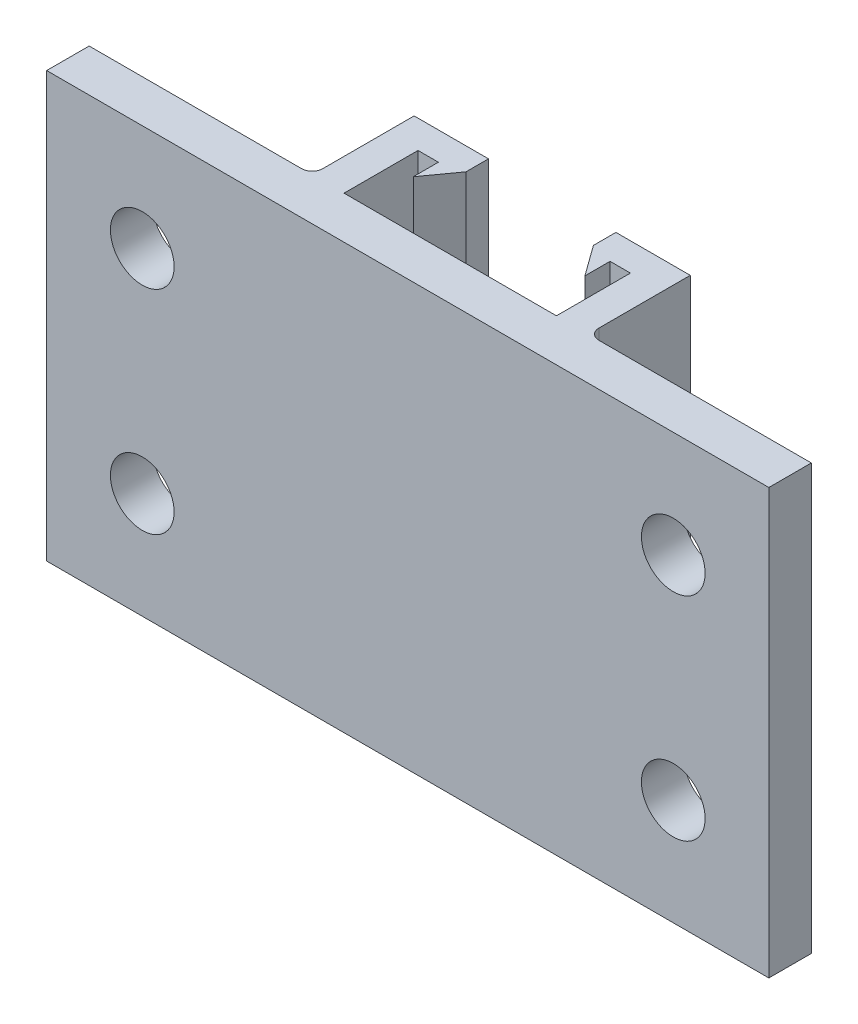
ISO-10303-21;
HEADER;
FILE_DESCRIPTION(('STEP AP214'),'2;1');
FILE_NAME('part.step','',(''),(''),'','','');
FILE_SCHEMA(('AUTOMOTIVE_DESIGN { 1 0 10303 214 1 1 1 1 }'));
ENDSEC;
DATA;
#1=APPLICATION_CONTEXT('core data for automotive mechanical design processes');
#2=APPLICATION_PROTOCOL_DEFINITION('international standard','automotive_design',2000,#1);
#3=PRODUCT_CONTEXT('',#1,'mechanical');
#4=PRODUCT('Part','Part','',(#3));
#5=PRODUCT_RELATED_PRODUCT_CATEGORY('part','',(#4));
#6=PRODUCT_DEFINITION_FORMATION('','',#4);
#7=PRODUCT_DEFINITION_CONTEXT('part definition',#1,'design');
#8=PRODUCT_DEFINITION('design','',#6,#7);
#9=PRODUCT_DEFINITION_SHAPE('','',#8);
#10=(LENGTH_UNIT() NAMED_UNIT(*) SI_UNIT(.MILLI.,.METRE.));
#11=(NAMED_UNIT(*) PLANE_ANGLE_UNIT() SI_UNIT($,.RADIAN.));
#12=(NAMED_UNIT(*) SI_UNIT($,.STERADIAN.) SOLID_ANGLE_UNIT());
#13=UNCERTAINTY_MEASURE_WITH_UNIT(LENGTH_MEASURE(1.E-05),#10,'distance_accuracy_value','');
#14=(GEOMETRIC_REPRESENTATION_CONTEXT(3) GLOBAL_UNCERTAINTY_ASSIGNED_CONTEXT((#13)) GLOBAL_UNIT_ASSIGNED_CONTEXT((#10,
#11,#12)) REPRESENTATION_CONTEXT('',''));
#15=CARTESIAN_POINT('',(0.,0.,0.));
#16=DIRECTION('',(0.,0.,1.));
#17=DIRECTION('',(1.,0.,0.));
#18=AXIS2_PLACEMENT_3D('',#15,#16,#17);
#19=CARTESIAN_POINT('',(0.,0.,0.));
#20=DIRECTION('',(0.,0.,1.));
#21=DIRECTION('',(1.,0.,0.));
#22=AXIS2_PLACEMENT_3D('',#19,#20,#21);
#23=PLANE('',#22);
#24=CARTESIAN_POINT('',(12.5,5.,0.));
#25=DIRECTION('',(0.,0.,1.));
#26=DIRECTION('',(1.,0.,0.));
#27=AXIS2_PLACEMENT_3D('',#24,#25,#26);
#28=CIRCLE('',#27,1.5);
#29=CARTESIAN_POINT('',(14.,5.,0.));
#30=VERTEX_POINT('',#29);
#31=EDGE_CURVE('E396',#30,#30,#28,.T.);
#32=ORIENTED_EDGE('',*,*,#31,.T.);
#33=EDGE_LOOP('',(#32));
#34=FACE_BOUND('',#33,.T.);
#35=CARTESIAN_POINT('',(12.5000000000001,-5.,0.));
#36=DIRECTION('',(0.,0.,1.));
#37=DIRECTION('',(1.,0.,0.));
#38=AXIS2_PLACEMENT_3D('',#35,#36,#37);
#39=CIRCLE('',#38,1.5);
#40=CARTESIAN_POINT('',(14.0000000000001,-5.,0.));
#41=VERTEX_POINT('',#40);
#42=EDGE_CURVE('E338',#41,#41,#39,.T.);
#43=ORIENTED_EDGE('',*,*,#42,.T.);
#44=EDGE_LOOP('',(#43));
#45=FACE_BOUND('',#44,.T.);
#46=DIRECTION('',(1.,0.,0.));
#47=VECTOR('',#46,1.);
#48=CARTESIAN_POINT('',(0.,-10.,0.));
#49=LINE('',#48,#47);
#50=CARTESIAN_POINT('',(7.,-10.,0.));
#51=VERTEX_POINT('',#50);
#52=CARTESIAN_POINT('',(17.,-10.,0.));
#53=VERTEX_POINT('',#52);
#54=EDGE_CURVE('E404',#51,#53,#49,.T.);
#55=ORIENTED_EDGE('',*,*,#54,.F.);
#56=DIRECTION('',(0.,1.,0.));
#57=VECTOR('',#56,1.);
#58=CARTESIAN_POINT('',(7.,0.,0.));
#59=LINE('',#58,#57);
#60=CARTESIAN_POINT('',(7.,10.,0.));
#61=VERTEX_POINT('',#60);
#62=EDGE_CURVE('E434',#51,#61,#59,.T.);
#63=ORIENTED_EDGE('',*,*,#62,.T.);
#64=DIRECTION('',(1.,0.,0.));
#65=VECTOR('',#64,1.);
#66=CARTESIAN_POINT('',(0.,10.,0.));
#67=LINE('',#66,#65);
#68=CARTESIAN_POINT('',(17.,10.,0.));
#69=VERTEX_POINT('',#68);
#70=EDGE_CURVE('E413',#61,#69,#67,.T.);
#71=ORIENTED_EDGE('',*,*,#70,.T.);
#72=DIRECTION('',(0.,1.,0.));
#73=VECTOR('',#72,1.);
#74=CARTESIAN_POINT('',(17.,0.,0.));
#75=LINE('',#74,#73);
#76=EDGE_CURVE('E408',#53,#69,#75,.T.);
#77=ORIENTED_EDGE('',*,*,#76,.F.);
#78=EDGE_LOOP('',(#55,#63,#71,#77));
#79=FACE_BOUND('',#78,.T.);
#80=ADVANCED_FACE('F40',(#34,#45,#79),#23,.F.);
#81=CARTESIAN_POINT('',(-12.4999999999999,-5.00000000000018,0.));
#82=DIRECTION('',(0.,0.,1.));
#83=DIRECTION('',(1.,0.,0.));
#84=AXIS2_PLACEMENT_3D('',#81,#82,#83);
#85=CIRCLE('',#84,1.5);
#86=CARTESIAN_POINT('',(-10.9999999999999,-5.00000000000018,0.));
#87=VERTEX_POINT('',#86);
#88=EDGE_CURVE('E392',#87,#87,#85,.T.);
#89=ORIENTED_EDGE('',*,*,#88,.T.);
#90=EDGE_LOOP('',(#89));
#91=FACE_BOUND('',#90,.T.);
#92=CARTESIAN_POINT('',(-12.5,4.99999999999982,0.));
#93=DIRECTION('',(0.,0.,1.));
#94=DIRECTION('',(1.,0.,0.));
#95=AXIS2_PLACEMENT_3D('',#92,#93,#94);
#96=CIRCLE('',#95,1.5);
#97=CARTESIAN_POINT('',(-11.,4.99999999999982,0.));
#98=VERTEX_POINT('',#97);
#99=EDGE_CURVE('E400',#98,#98,#96,.T.);
#100=ORIENTED_EDGE('',*,*,#99,.T.);
#101=EDGE_LOOP('',(#100));
#102=FACE_BOUND('',#101,.T.);
#103=CARTESIAN_POINT('',(-17.,10.,0.));
#104=VERTEX_POINT('',#103);
#105=CARTESIAN_POINT('',(-7.,10.,0.));
#106=VERTEX_POINT('',#105);
#107=EDGE_CURVE('E414',#104,#106,#67,.T.);
#108=ORIENTED_EDGE('',*,*,#107,.T.);
#109=DIRECTION('',(0.,1.,0.));
#110=VECTOR('',#109,1.);
#111=CARTESIAN_POINT('',(-7.,0.,0.));
#112=LINE('',#111,#110);
#113=CARTESIAN_POINT('',(-7.,-10.,0.));
#114=VERTEX_POINT('',#113);
#115=EDGE_CURVE('E62',#106,#114,#112,.F.);
#116=ORIENTED_EDGE('',*,*,#115,.T.);
#117=CARTESIAN_POINT('',(-17.,-10.,0.));
#118=VERTEX_POINT('',#117);
#119=EDGE_CURVE('E405',#118,#114,#49,.T.);
#120=ORIENTED_EDGE('',*,*,#119,.F.);
#121=DIRECTION('',(0.,1.,0.));
#122=VECTOR('',#121,1.);
#123=CARTESIAN_POINT('',(-17.,0.,0.));
#124=LINE('',#123,#122);
#125=EDGE_CURVE('E361',#118,#104,#124,.T.);
#126=ORIENTED_EDGE('',*,*,#125,.T.);
#127=EDGE_LOOP('',(#108,#116,#120,#126));
#128=FACE_BOUND('',#127,.T.);
#129=ADVANCED_FACE('F477',(#91,#102,#128),#23,.F.);
#130=CARTESIAN_POINT('',(0.,-10.,2.));
#131=DIRECTION('',(0.,1.,0.));
#132=DIRECTION('',(0.,0.,1.));
#133=AXIS2_PLACEMENT_3D('',#130,#131,#132);
#134=PLANE('',#133);
#135=ORIENTED_EDGE('',*,*,#119,.T.);
#136=CARTESIAN_POINT('',(-7.,-10.,-0.5));
#137=DIRECTION('',(0.,1.,0.));
#138=DIRECTION('',(0.,0.,1.));
#139=AXIS2_PLACEMENT_3D('',#136,#137,#138);
#140=CIRCLE('',#139,0.5);
#141=CARTESIAN_POINT('',(-6.5,-10.,-0.5));
#142=VERTEX_POINT('',#141);
#143=EDGE_CURVE('E11',#114,#142,#140,.T.);
#144=ORIENTED_EDGE('',*,*,#143,.T.);
#145=DIRECTION('',(0.,0.,1.));
#146=VECTOR('',#145,1.);
#147=CARTESIAN_POINT('',(-6.5,-10.,0.));
#148=LINE('',#147,#146);
#149=CARTESIAN_POINT('',(-6.5,-10.,-4.8));
#150=VERTEX_POINT('',#149);
#151=EDGE_CURVE('E304',#150,#142,#148,.T.);
#152=ORIENTED_EDGE('',*,*,#151,.F.);
#153=DIRECTION('',(-1.,0.,0.));
#154=VECTOR('',#153,1.);
#155=CARTESIAN_POINT('',(-3.,-10.,-4.8));
#156=LINE('',#155,#154);
#157=CARTESIAN_POINT('',(-3.,-10.,-4.8));
#158=VERTEX_POINT('',#157);
#159=EDGE_CURVE('E300',#158,#150,#156,.T.);
#160=ORIENTED_EDGE('',*,*,#159,.F.);
#161=DIRECTION('',(0.,0.,-1.));
#162=VECTOR('',#161,1.);
#163=CARTESIAN_POINT('',(-3.,-10.,-4.8));
#164=LINE('',#163,#162);
#165=CARTESIAN_POINT('',(-3.,-10.,-3.74108937767735));
#166=VERTEX_POINT('',#165);
#167=EDGE_CURVE('E296',#166,#158,#164,.T.);
#168=ORIENTED_EDGE('',*,*,#167,.F.);
#169=DIRECTION('',(0.58540795940283,0.,-0.810738873539325));
#170=VECTOR('',#169,1.);
#171=CARTESIAN_POINT('',(-3.,-10.,-3.74108937767735));
#172=LINE('',#171,#170);
#173=CARTESIAN_POINT('',(-4.04056339153975,-10.,-2.3));
#174=VERTEX_POINT('',#173);
#175=EDGE_CURVE('E292',#174,#166,#172,.T.);
#176=ORIENTED_EDGE('',*,*,#175,.F.);
#177=DIRECTION('',(0.,0.,1.));
#178=VECTOR('',#177,1.);
#179=CARTESIAN_POINT('',(-4.04056339153975,-10.,-2.3));
#180=LINE('',#179,#178);
#181=CARTESIAN_POINT('',(-4.04056339153975,-10.,-3.48273201808669));
#182=VERTEX_POINT('',#181);
#183=EDGE_CURVE('E288',#182,#174,#180,.T.);
#184=ORIENTED_EDGE('',*,*,#183,.F.);
#185=DIRECTION('',(1.,0.,0.));
#186=VECTOR('',#185,1.);
#187=CARTESIAN_POINT('',(-4.04056339153975,-10.,-3.48273201808669));
#188=LINE('',#187,#186);
#189=CARTESIAN_POINT('',(-5.,-10.,-3.48273201808669));
#190=VERTEX_POINT('',#189);
#191=EDGE_CURVE('E283',#190,#182,#188,.T.);
#192=ORIENTED_EDGE('',*,*,#191,.F.);
#193=DIRECTION('',(0.,0.,-1.));
#194=VECTOR('',#193,1.);
#195=CARTESIAN_POINT('',(-5.,-10.,0.));
#196=LINE('',#195,#194);
#197=CARTESIAN_POINT('',(-5.,-10.,0.));
#198=VERTEX_POINT('',#197);
#199=EDGE_CURVE('E279',#198,#190,#196,.T.);
#200=ORIENTED_EDGE('',*,*,#199,.F.);
#201=CARTESIAN_POINT('',(5.,-10.,0.));
#202=VERTEX_POINT('',#201);
#203=EDGE_CURVE('E409',#198,#202,#49,.T.);
#204=ORIENTED_EDGE('',*,*,#203,.T.);
#205=DIRECTION('',(0.,0.,1.));
#206=VECTOR('',#205,1.);
#207=CARTESIAN_POINT('',(5.,-10.,0.));
#208=LINE('',#207,#206);
#209=CARTESIAN_POINT('',(5.,-10.,-3.48273201808669));
#210=VERTEX_POINT('',#209);
#211=EDGE_CURVE('E232',#210,#202,#208,.T.);
#212=ORIENTED_EDGE('',*,*,#211,.F.);
#213=DIRECTION('',(1.,0.,0.));
#214=VECTOR('',#213,1.);
#215=CARTESIAN_POINT('',(4.04056339153975,-10.,-3.48273201808669));
#216=LINE('',#215,#214);
#217=CARTESIAN_POINT('',(4.04056339153975,-10.,-3.48273201808669));
#218=VERTEX_POINT('',#217);
#219=EDGE_CURVE('E228',#218,#210,#216,.T.);
#220=ORIENTED_EDGE('',*,*,#219,.F.);
#221=DIRECTION('',(0.,0.,-1.));
#222=VECTOR('',#221,1.);
#223=CARTESIAN_POINT('',(4.04056339153975,-10.,-2.3));
#224=LINE('',#223,#222);
#225=CARTESIAN_POINT('',(4.04056339153975,-10.,-2.3));
#226=VERTEX_POINT('',#225);
#227=EDGE_CURVE('E213',#226,#218,#224,.T.);
#228=ORIENTED_EDGE('',*,*,#227,.F.);
#229=DIRECTION('',(0.58540795940283,0.,0.810738873539325));
#230=VECTOR('',#229,1.);
#231=CARTESIAN_POINT('',(3.,-10.,-3.74108937767735));
#232=LINE('',#231,#230);
#233=CARTESIAN_POINT('',(3.,-10.,-3.74108937767735));
#234=VERTEX_POINT('',#233);
#235=EDGE_CURVE('E193',#234,#226,#232,.T.);
#236=ORIENTED_EDGE('',*,*,#235,.F.);
#237=DIRECTION('',(0.,0.,1.));
#238=VECTOR('',#237,1.);
#239=CARTESIAN_POINT('',(3.,-10.,-4.8));
#240=LINE('',#239,#238);
#241=CARTESIAN_POINT('',(3.,-10.,-4.8));
#242=VERTEX_POINT('',#241);
#243=EDGE_CURVE('E209',#242,#234,#240,.T.);
#244=ORIENTED_EDGE('',*,*,#243,.F.);
#245=DIRECTION('',(-1.,0.,0.));
#246=VECTOR('',#245,1.);
#247=CARTESIAN_POINT('',(3.,-10.,-4.8));
#248=LINE('',#247,#246);
#249=CARTESIAN_POINT('',(6.5,-10.,-4.8));
#250=VERTEX_POINT('',#249);
#251=EDGE_CURVE('E202',#250,#242,#248,.T.);
#252=ORIENTED_EDGE('',*,*,#251,.F.);
#253=DIRECTION('',(0.,0.,-1.));
#254=VECTOR('',#253,1.);
#255=CARTESIAN_POINT('',(6.5,-10.,0.));
#256=LINE('',#255,#254);
#257=CARTESIAN_POINT('',(6.5,-10.,-0.5));
#258=VERTEX_POINT('',#257);
#259=EDGE_CURVE('E236',#258,#250,#256,.T.);
#260=ORIENTED_EDGE('',*,*,#259,.F.);
#261=CARTESIAN_POINT('',(7.,-10.,-0.5));
#262=DIRECTION('',(0.,1.,0.));
#263=DIRECTION('',(0.,0.,1.));
#264=AXIS2_PLACEMENT_3D('',#261,#262,#263);
#265=CIRCLE('',#264,0.5);
#266=EDGE_CURVE('E450',#258,#51,#265,.T.);
#267=ORIENTED_EDGE('',*,*,#266,.T.);
#268=ORIENTED_EDGE('',*,*,#54,.T.);
#269=DIRECTION('',(0.,0.,-1.));
#270=VECTOR('',#269,1.);
#271=CARTESIAN_POINT('',(17.,-10.,2.));
#272=LINE('',#271,#270);
#273=CARTESIAN_POINT('',(17.,-10.,2.));
#274=VERTEX_POINT('',#273);
#275=EDGE_CURVE('E430',#274,#53,#272,.T.);
#276=ORIENTED_EDGE('',*,*,#275,.F.);
#277=DIRECTION('',(1.,0.,0.));
#278=VECTOR('',#277,1.);
#279=CARTESIAN_POINT('',(0.,-10.,2.));
#280=LINE('',#279,#278);
#281=CARTESIAN_POINT('',(-17.,-10.,2.));
#282=VERTEX_POINT('',#281);
#283=EDGE_CURVE('E373',#282,#274,#280,.T.);
#284=ORIENTED_EDGE('',*,*,#283,.F.);
#285=DIRECTION('',(0.,0.,-1.));
#286=VECTOR('',#285,1.);
#287=CARTESIAN_POINT('',(-17.,-10.,2.));
#288=LINE('',#287,#286);
#289=EDGE_CURVE('E388',#282,#118,#288,.T.);
#290=ORIENTED_EDGE('',*,*,#289,.T.);
#291=EDGE_LOOP('',(#135,#144,#152,#160,#168,#176,#184,#192,#200,#204,#212,#220,#228,#236,#244,
#252,#260,#267,#268,#276,#284,#290));
#292=FACE_BOUND('',#291,.T.);
#293=ADVANCED_FACE('F207',(#292),#134,.F.);
#294=CARTESIAN_POINT('',(17.,0.,2.));
#295=DIRECTION('',(-1.,0.,0.));
#296=DIRECTION('',(0.,0.,1.));
#297=AXIS2_PLACEMENT_3D('',#294,#295,#296);
#298=PLANE('',#297);
#299=ORIENTED_EDGE('',*,*,#76,.T.);
#300=DIRECTION('',(0.,0.,-1.));
#301=VECTOR('',#300,1.);
#302=CARTESIAN_POINT('',(17.,10.,2.));
#303=LINE('',#302,#301);
#304=CARTESIAN_POINT('',(17.,10.,2.));
#305=VERTEX_POINT('',#304);
#306=EDGE_CURVE('E426',#305,#69,#303,.T.);
#307=ORIENTED_EDGE('',*,*,#306,.F.);
#308=DIRECTION('',(0.,1.,0.));
#309=VECTOR('',#308,1.);
#310=CARTESIAN_POINT('',(17.,0.,2.));
#311=LINE('',#310,#309);
#312=EDGE_CURVE('E377',#274,#305,#311,.T.);
#313=ORIENTED_EDGE('',*,*,#312,.F.);
#314=ORIENTED_EDGE('',*,*,#275,.T.);
#315=EDGE_LOOP('',(#299,#307,#313,#314));
#316=FACE_BOUND('',#315,.T.);
#317=ADVANCED_FACE('F469',(#316),#298,.F.);
#318=CARTESIAN_POINT('',(0.,10.,2.));
#319=DIRECTION('',(0.,1.,0.));
#320=DIRECTION('',(0.,0.,1.));
#321=AXIS2_PLACEMENT_3D('',#318,#319,#320);
#322=PLANE('',#321);
#323=ORIENTED_EDGE('',*,*,#107,.F.);
#324=DIRECTION('',(0.,0.,-1.));
#325=VECTOR('',#324,1.);
#326=CARTESIAN_POINT('',(-17.,10.,2.));
#327=LINE('',#326,#325);
#328=CARTESIAN_POINT('',(-17.,10.,2.));
#329=VERTEX_POINT('',#328);
#330=EDGE_CURVE('E423',#329,#104,#327,.T.);
#331=ORIENTED_EDGE('',*,*,#330,.F.);
#332=DIRECTION('',(1.,0.,0.));
#333=VECTOR('',#332,1.);
#334=CARTESIAN_POINT('',(0.,10.,2.));
#335=LINE('',#334,#333);
#336=EDGE_CURVE('E380',#329,#305,#335,.T.);
#337=ORIENTED_EDGE('',*,*,#336,.T.);
#338=ORIENTED_EDGE('',*,*,#306,.T.);
#339=ORIENTED_EDGE('',*,*,#70,.F.);
#340=CARTESIAN_POINT('',(7.,10.,-0.5));
#341=DIRECTION('',(0.,1.,0.));
#342=DIRECTION('',(0.,0.,1.));
#343=AXIS2_PLACEMENT_3D('',#340,#341,#342);
#344=CIRCLE('',#343,0.5);
#345=CARTESIAN_POINT('',(6.5,10.,-0.5));
#346=VERTEX_POINT('',#345);
#347=EDGE_CURVE('E447',#61,#346,#344,.F.);
#348=ORIENTED_EDGE('',*,*,#347,.T.);
#349=DIRECTION('',(0.,0.,-1.));
#350=VECTOR('',#349,1.);
#351=CARTESIAN_POINT('',(6.5,10.,0.));
#352=LINE('',#351,#350);
#353=CARTESIAN_POINT('',(6.5,10.,-4.8));
#354=VERTEX_POINT('',#353);
#355=EDGE_CURVE('E223',#346,#354,#352,.T.);
#356=ORIENTED_EDGE('',*,*,#355,.T.);
#357=DIRECTION('',(-1.,0.,0.));
#358=VECTOR('',#357,1.);
#359=CARTESIAN_POINT('',(3.,10.,-4.8));
#360=LINE('',#359,#358);
#361=CARTESIAN_POINT('',(3.,10.,-4.8));
#362=VERTEX_POINT('',#361);
#363=EDGE_CURVE('E219',#354,#362,#360,.T.);
#364=ORIENTED_EDGE('',*,*,#363,.T.);
#365=DIRECTION('',(0.,0.,1.));
#366=VECTOR('',#365,1.);
#367=CARTESIAN_POINT('',(3.,10.,-4.8));
#368=LINE('',#367,#366);
#369=CARTESIAN_POINT('',(3.,10.,-3.74108937767735));
#370=VERTEX_POINT('',#369);
#371=EDGE_CURVE('E241',#362,#370,#368,.T.);
#372=ORIENTED_EDGE('',*,*,#371,.T.);
#373=DIRECTION('',(0.58540795940283,0.,0.810738873539325));
#374=VECTOR('',#373,1.);
#375=CARTESIAN_POINT('',(3.,10.,-3.74108937767735));
#376=LINE('',#375,#374);
#377=CARTESIAN_POINT('',(4.04056339153975,10.,-2.3));
#378=VERTEX_POINT('',#377);
#379=EDGE_CURVE('E195',#370,#378,#376,.T.);
#380=ORIENTED_EDGE('',*,*,#379,.T.);
#381=DIRECTION('',(0.,0.,-1.));
#382=VECTOR('',#381,1.);
#383=CARTESIAN_POINT('',(4.04056339153975,10.,-2.3));
#384=LINE('',#383,#382);
#385=CARTESIAN_POINT('',(4.04056339153975,10.,-3.48273201808669));
#386=VERTEX_POINT('',#385);
#387=EDGE_CURVE('E246',#378,#386,#384,.T.);
#388=ORIENTED_EDGE('',*,*,#387,.T.);
#389=DIRECTION('',(1.,0.,0.));
#390=VECTOR('',#389,1.);
#391=CARTESIAN_POINT('',(4.04056339153975,10.,-3.48273201808669));
#392=LINE('',#391,#390);
#393=CARTESIAN_POINT('',(5.,10.,-3.48273201808669));
#394=VERTEX_POINT('',#393);
#395=EDGE_CURVE('E250',#386,#394,#392,.T.);
#396=ORIENTED_EDGE('',*,*,#395,.T.);
#397=DIRECTION('',(0.,0.,1.));
#398=VECTOR('',#397,1.);
#399=CARTESIAN_POINT('',(5.,10.,0.));
#400=LINE('',#399,#398);
#401=CARTESIAN_POINT('',(5.,10.,0.));
#402=VERTEX_POINT('',#401);
#403=EDGE_CURVE('E254',#394,#402,#400,.T.);
#404=ORIENTED_EDGE('',*,*,#403,.T.);
#405=CARTESIAN_POINT('',(-5.,10.,0.));
#406=VERTEX_POINT('',#405);
#407=EDGE_CURVE('E417',#406,#402,#67,.T.);
#408=ORIENTED_EDGE('',*,*,#407,.F.);
#409=DIRECTION('',(0.,0.,-1.));
#410=VECTOR('',#409,1.);
#411=CARTESIAN_POINT('',(-5.,10.,0.));
#412=LINE('',#411,#410);
#413=CARTESIAN_POINT('',(-5.,10.,-3.48273201808669));
#414=VERTEX_POINT('',#413);
#415=EDGE_CURVE('E262',#406,#414,#412,.T.);
#416=ORIENTED_EDGE('',*,*,#415,.T.);
#417=DIRECTION('',(1.,0.,0.));
#418=VECTOR('',#417,1.);
#419=CARTESIAN_POINT('',(-4.04056339153975,10.,-3.48273201808669));
#420=LINE('',#419,#418);
#421=CARTESIAN_POINT('',(-4.04056339153975,10.,-3.48273201808669));
#422=VERTEX_POINT('',#421);
#423=EDGE_CURVE('E312',#414,#422,#420,.T.);
#424=ORIENTED_EDGE('',*,*,#423,.T.);
#425=DIRECTION('',(0.,0.,1.));
#426=VECTOR('',#425,1.);
#427=CARTESIAN_POINT('',(-4.04056339153975,10.,-2.3));
#428=LINE('',#427,#426);
#429=CARTESIAN_POINT('',(-4.04056339153975,10.,-2.3));
#430=VERTEX_POINT('',#429);
#431=EDGE_CURVE('E316',#422,#430,#428,.T.);
#432=ORIENTED_EDGE('',*,*,#431,.T.);
#433=DIRECTION('',(0.58540795940283,0.,-0.810738873539325));
#434=VECTOR('',#433,1.);
#435=CARTESIAN_POINT('',(-3.,10.,-3.74108937767735));
#436=LINE('',#435,#434);
#437=CARTESIAN_POINT('',(-3.,10.,-3.74108937767735));
#438=VERTEX_POINT('',#437);
#439=EDGE_CURVE('E320',#430,#438,#436,.T.);
#440=ORIENTED_EDGE('',*,*,#439,.T.);
#441=DIRECTION('',(0.,0.,-1.));
#442=VECTOR('',#441,1.);
#443=CARTESIAN_POINT('',(-3.,10.,-4.8));
#444=LINE('',#443,#442);
#445=CARTESIAN_POINT('',(-3.,10.,-4.8));
#446=VERTEX_POINT('',#445);
#447=EDGE_CURVE('E324',#438,#446,#444,.T.);
#448=ORIENTED_EDGE('',*,*,#447,.T.);
#449=DIRECTION('',(-1.,0.,0.));
#450=VECTOR('',#449,1.);
#451=CARTESIAN_POINT('',(-3.,10.,-4.8));
#452=LINE('',#451,#450);
#453=CARTESIAN_POINT('',(-6.5,10.,-4.8));
#454=VERTEX_POINT('',#453);
#455=EDGE_CURVE('E328',#446,#454,#452,.T.);
#456=ORIENTED_EDGE('',*,*,#455,.T.);
#457=DIRECTION('',(0.,0.,1.));
#458=VECTOR('',#457,1.);
#459=CARTESIAN_POINT('',(-6.5,10.,0.));
#460=LINE('',#459,#458);
#461=CARTESIAN_POINT('',(-6.5,10.,-0.5));
#462=VERTEX_POINT('',#461);
#463=EDGE_CURVE('E284',#454,#462,#460,.T.);
#464=ORIENTED_EDGE('',*,*,#463,.T.);
#465=CARTESIAN_POINT('',(-7.,10.,-0.5));
#466=DIRECTION('',(0.,1.,0.));
#467=DIRECTION('',(0.,0.,1.));
#468=AXIS2_PLACEMENT_3D('',#465,#466,#467);
#469=CIRCLE('',#468,0.5);
#470=EDGE_CURVE('E49',#462,#106,#469,.F.);
#471=ORIENTED_EDGE('',*,*,#470,.T.);
#472=EDGE_LOOP('',(#323,#331,#337,#338,#339,#348,#356,#364,#372,#380,#388,#396,#404,#408,#416,
#424,#432,#440,#448,#456,#464,#471));
#473=FACE_BOUND('',#472,.T.);
#474=ADVANCED_FACE('F479',(#473),#322,.T.);
#475=CARTESIAN_POINT('',(-12.5,4.99999999999982,2.));
#476=DIRECTION('',(0.,0.,-1.));
#477=DIRECTION('',(-1.,0.,0.));
#478=AXIS2_PLACEMENT_3D('',#475,#476,#477);
#479=CYLINDRICAL_SURFACE('',#478,1.5);
#480=CARTESIAN_POINT('',(-12.5,4.99999999999982,2.));
#481=DIRECTION('',(0.,0.,1.));
#482=DIRECTION('',(1.,0.,0.));
#483=AXIS2_PLACEMENT_3D('',#480,#481,#482);
#484=CIRCLE('',#483,1.5);
#485=CARTESIAN_POINT('',(-11.,4.99999999999982,2.));
#486=VERTEX_POINT('',#485);
#487=EDGE_CURVE('E369',#486,#486,#484,.T.);
#488=ORIENTED_EDGE('',*,*,#487,.T.);
#489=EDGE_LOOP('',(#488));
#490=FACE_BOUND('',#489,.T.);
#491=ORIENTED_EDGE('',*,*,#99,.F.);
#492=EDGE_LOOP('',(#491));
#493=FACE_BOUND('',#492,.T.);
#494=ADVANCED_FACE('F677',(#490,#493),#479,.F.);
#495=CARTESIAN_POINT('',(12.5,5.,2.));
#496=DIRECTION('',(0.,0.,-1.));
#497=DIRECTION('',(-1.,0.,0.));
#498=AXIS2_PLACEMENT_3D('',#495,#496,#497);
#499=CYLINDRICAL_SURFACE('',#498,1.5);
#500=CARTESIAN_POINT('',(12.5,5.,2.));
#501=DIRECTION('',(0.,0.,1.));
#502=DIRECTION('',(1.,0.,0.));
#503=AXIS2_PLACEMENT_3D('',#500,#501,#502);
#504=CIRCLE('',#503,1.5);
#505=CARTESIAN_POINT('',(14.,5.,2.));
#506=VERTEX_POINT('',#505);
#507=EDGE_CURVE('E365',#506,#506,#504,.T.);
#508=ORIENTED_EDGE('',*,*,#507,.T.);
#509=EDGE_LOOP('',(#508));
#510=FACE_BOUND('',#509,.T.);
#511=ORIENTED_EDGE('',*,*,#31,.F.);
#512=EDGE_LOOP('',(#511));
#513=FACE_BOUND('',#512,.T.);
#514=ADVANCED_FACE('F727',(#510,#513),#499,.F.);
#515=CARTESIAN_POINT('',(-12.4999999999999,-5.00000000000018,2.));
#516=DIRECTION('',(0.,0.,-1.));
#517=DIRECTION('',(-1.,0.,0.));
#518=AXIS2_PLACEMENT_3D('',#515,#516,#517);
#519=CYLINDRICAL_SURFACE('',#518,1.5);
#520=CARTESIAN_POINT('',(-12.4999999999999,-5.00000000000018,2.));
#521=DIRECTION('',(0.,0.,1.));
#522=DIRECTION('',(1.,0.,0.));
#523=AXIS2_PLACEMENT_3D('',#520,#521,#522);
#524=CIRCLE('',#523,1.5);
#525=CARTESIAN_POINT('',(-10.9999999999999,-5.00000000000018,2.));
#526=VERTEX_POINT('',#525);
#527=EDGE_CURVE('E360',#526,#526,#524,.T.);
#528=ORIENTED_EDGE('',*,*,#527,.T.);
#529=EDGE_LOOP('',(#528));
#530=FACE_BOUND('',#529,.T.);
#531=ORIENTED_EDGE('',*,*,#88,.F.);
#532=EDGE_LOOP('',(#531));
#533=FACE_BOUND('',#532,.T.);
#534=ADVANCED_FACE('F736',(#530,#533),#519,.F.);
#535=CARTESIAN_POINT('',(12.5000000000001,-5.,2.));
#536=DIRECTION('',(0.,0.,-1.));
#537=DIRECTION('',(-1.,0.,0.));
#538=AXIS2_PLACEMENT_3D('',#535,#536,#537);
#539=CYLINDRICAL_SURFACE('',#538,1.5);
#540=CARTESIAN_POINT('',(12.5000000000001,-5.,2.));
#541=DIRECTION('',(0.,0.,1.));
#542=DIRECTION('',(1.,0.,0.));
#543=AXIS2_PLACEMENT_3D('',#540,#541,#542);
#544=CIRCLE('',#543,1.5);
#545=CARTESIAN_POINT('',(14.0000000000001,-5.,2.));
#546=VERTEX_POINT('',#545);
#547=EDGE_CURVE('E356',#546,#546,#544,.T.);
#548=ORIENTED_EDGE('',*,*,#547,.T.);
#549=EDGE_LOOP('',(#548));
#550=FACE_BOUND('',#549,.T.);
#551=ORIENTED_EDGE('',*,*,#42,.F.);
#552=EDGE_LOOP('',(#551));
#553=FACE_BOUND('',#552,.T.);
#554=ADVANCED_FACE('F561',(#550,#553),#539,.F.);
#555=CARTESIAN_POINT('',(-17.,0.,2.));
#556=DIRECTION('',(-1.,0.,0.));
#557=DIRECTION('',(0.,0.,1.));
#558=AXIS2_PLACEMENT_3D('',#555,#556,#557);
#559=PLANE('',#558);
#560=ORIENTED_EDGE('',*,*,#125,.F.);
#561=ORIENTED_EDGE('',*,*,#289,.F.);
#562=DIRECTION('',(0.,1.,0.));
#563=VECTOR('',#562,1.);
#564=CARTESIAN_POINT('',(-17.,0.,2.));
#565=LINE('',#564,#563);
#566=EDGE_CURVE('E384',#282,#329,#565,.T.);
#567=ORIENTED_EDGE('',*,*,#566,.T.);
#568=ORIENTED_EDGE('',*,*,#330,.T.);
#569=EDGE_LOOP('',(#560,#561,#567,#568));
#570=FACE_BOUND('',#569,.T.);
#571=ADVANCED_FACE('F478',(#570),#559,.T.);
#572=CARTESIAN_POINT('',(0.,0.,2.));
#573=DIRECTION('',(0.,0.,1.));
#574=DIRECTION('',(1.,0.,0.));
#575=AXIS2_PLACEMENT_3D('',#572,#573,#574);
#576=PLANE('',#575);
#577=ORIENTED_EDGE('',*,*,#547,.F.);
#578=EDGE_LOOP('',(#577));
#579=FACE_BOUND('',#578,.T.);
#580=ORIENTED_EDGE('',*,*,#527,.F.);
#581=EDGE_LOOP('',(#580));
#582=FACE_BOUND('',#581,.T.);
#583=ORIENTED_EDGE('',*,*,#507,.F.);
#584=EDGE_LOOP('',(#583));
#585=FACE_BOUND('',#584,.T.);
#586=ORIENTED_EDGE('',*,*,#487,.F.);
#587=EDGE_LOOP('',(#586));
#588=FACE_BOUND('',#587,.T.);
#589=ORIENTED_EDGE('',*,*,#283,.T.);
#590=ORIENTED_EDGE('',*,*,#312,.T.);
#591=ORIENTED_EDGE('',*,*,#336,.F.);
#592=ORIENTED_EDGE('',*,*,#566,.F.);
#593=EDGE_LOOP('',(#589,#590,#591,#592));
#594=FACE_BOUND('',#593,.T.);
#595=ADVANCED_FACE('F473',(#579,#582,#585,#588,#594),#576,.T.);
#596=ORIENTED_EDGE('',*,*,#407,.T.);
#597=DIRECTION('',(0.,1.,0.));
#598=VECTOR('',#597,1.);
#599=CARTESIAN_POINT('',(5.,-10.,0.));
#600=LINE('',#599,#598);
#601=EDGE_CURVE('E267',#202,#402,#600,.T.);
#602=ORIENTED_EDGE('',*,*,#601,.F.);
#603=ORIENTED_EDGE('',*,*,#203,.F.);
#604=DIRECTION('',(0.,1.,0.));
#605=VECTOR('',#604,1.);
#606=CARTESIAN_POINT('',(-5.,-10.,0.));
#607=LINE('',#606,#605);
#608=EDGE_CURVE('E334',#198,#406,#607,.T.);
#609=ORIENTED_EDGE('',*,*,#608,.T.);
#610=EDGE_LOOP('',(#596,#602,#603,#609));
#611=FACE_BOUND('',#610,.T.);
#612=ADVANCED_FACE('F512',(#611),#23,.F.);
#613=CARTESIAN_POINT('',(-5.,-10.,0.));
#614=DIRECTION('',(1.,0.,0.));
#615=DIRECTION('',(0.,0.,-1.));
#616=AXIS2_PLACEMENT_3D('',#613,#614,#615);
#617=PLANE('',#616);
#618=ORIENTED_EDGE('',*,*,#415,.F.);
#619=ORIENTED_EDGE('',*,*,#608,.F.);
#620=ORIENTED_EDGE('',*,*,#199,.T.);
#621=DIRECTION('',(0.,1.,0.));
#622=VECTOR('',#621,1.);
#623=CARTESIAN_POINT('',(-5.,-10.,-3.48273201808669));
#624=LINE('',#623,#622);
#625=EDGE_CURVE('E308',#190,#414,#624,.T.);
#626=ORIENTED_EDGE('',*,*,#625,.T.);
#627=EDGE_LOOP('',(#618,#619,#620,#626));
#628=FACE_BOUND('',#627,.T.);
#629=ADVANCED_FACE('F509',(#628),#617,.T.);
#630=CARTESIAN_POINT('',(-6.5,-10.,0.));
#631=DIRECTION('',(-1.,0.,0.));
#632=DIRECTION('',(0.,0.,1.));
#633=AXIS2_PLACEMENT_3D('',#630,#631,#632);
#634=PLANE('',#633);
#635=ORIENTED_EDGE('',*,*,#151,.T.);
#636=DIRECTION('',(0.,1.,0.));
#637=VECTOR('',#636,1.);
#638=CARTESIAN_POINT('',(-6.5,-10.,-0.5));
#639=LINE('',#638,#637);
#640=EDGE_CURVE('E441',#142,#462,#639,.T.);
#641=ORIENTED_EDGE('',*,*,#640,.T.);
#642=ORIENTED_EDGE('',*,*,#463,.F.);
#643=DIRECTION('',(0.,1.,0.));
#644=VECTOR('',#643,1.);
#645=CARTESIAN_POINT('',(-6.5,-10.,-4.8));
#646=LINE('',#645,#644);
#647=EDGE_CURVE('E339',#150,#454,#646,.T.);
#648=ORIENTED_EDGE('',*,*,#647,.F.);
#649=EDGE_LOOP('',(#635,#641,#642,#648));
#650=FACE_BOUND('',#649,.T.);
#651=ADVANCED_FACE('F485',(#650),#634,.T.);
#652=CARTESIAN_POINT('',(-3.,-10.,-4.8));
#653=DIRECTION('',(0.,0.,-1.));
#654=DIRECTION('',(-1.,0.,0.));
#655=AXIS2_PLACEMENT_3D('',#652,#653,#654);
#656=PLANE('',#655);
#657=ORIENTED_EDGE('',*,*,#455,.F.);
#658=DIRECTION('',(0.,1.,0.));
#659=VECTOR('',#658,1.);
#660=CARTESIAN_POINT('',(-3.,-10.,-4.8));
#661=LINE('',#660,#659);
#662=EDGE_CURVE('E342',#158,#446,#661,.T.);
#663=ORIENTED_EDGE('',*,*,#662,.F.);
#664=ORIENTED_EDGE('',*,*,#159,.T.);
#665=ORIENTED_EDGE('',*,*,#647,.T.);
#666=EDGE_LOOP('',(#657,#663,#664,#665));
#667=FACE_BOUND('',#666,.T.);
#668=ADVANCED_FACE('F489',(#667),#656,.T.);
#669=CARTESIAN_POINT('',(-3.,-10.,-4.8));
#670=DIRECTION('',(1.,0.,0.));
#671=DIRECTION('',(0.,0.,-1.));
#672=AXIS2_PLACEMENT_3D('',#669,#670,#671);
#673=PLANE('',#672);
#674=ORIENTED_EDGE('',*,*,#447,.F.);
#675=DIRECTION('',(0.,1.,0.));
#676=VECTOR('',#675,1.);
#677=CARTESIAN_POINT('',(-3.,-10.,-3.74108937767735));
#678=LINE('',#677,#676);
#679=EDGE_CURVE('E345',#166,#438,#678,.T.);
#680=ORIENTED_EDGE('',*,*,#679,.F.);
#681=ORIENTED_EDGE('',*,*,#167,.T.);
#682=ORIENTED_EDGE('',*,*,#662,.T.);
#683=EDGE_LOOP('',(#674,#680,#681,#682));
#684=FACE_BOUND('',#683,.T.);
#685=ADVANCED_FACE('F494',(#684),#673,.T.);
#686=CARTESIAN_POINT('',(-3.,-10.,-3.74108937767735));
#687=DIRECTION('',(0.810738873539325,0.,0.58540795940283));
#688=DIRECTION('',(0.58540795940283,0.,-0.810738873539325));
#689=AXIS2_PLACEMENT_3D('',#686,#687,#688);
#690=PLANE('',#689);
#691=ORIENTED_EDGE('',*,*,#439,.F.);
#692=DIRECTION('',(0.,1.,0.));
#693=VECTOR('',#692,1.);
#694=CARTESIAN_POINT('',(-4.04056339153975,-10.,-2.3));
#695=LINE('',#694,#693);
#696=EDGE_CURVE('E348',#174,#430,#695,.T.);
#697=ORIENTED_EDGE('',*,*,#696,.F.);
#698=ORIENTED_EDGE('',*,*,#175,.T.);
#699=ORIENTED_EDGE('',*,*,#679,.T.);
#700=EDGE_LOOP('',(#691,#697,#698,#699));
#701=FACE_BOUND('',#700,.T.);
#702=ADVANCED_FACE('F497',(#701),#690,.T.);
#703=CARTESIAN_POINT('',(-4.04056339153975,-10.,-2.3));
#704=DIRECTION('',(-1.,0.,0.));
#705=DIRECTION('',(0.,0.,1.));
#706=AXIS2_PLACEMENT_3D('',#703,#704,#705);
#707=PLANE('',#706);
#708=ORIENTED_EDGE('',*,*,#431,.F.);
#709=DIRECTION('',(0.,1.,0.));
#710=VECTOR('',#709,1.);
#711=CARTESIAN_POINT('',(-4.04056339153975,-10.,-3.48273201808669));
#712=LINE('',#711,#710);
#713=EDGE_CURVE('E351',#182,#422,#712,.T.);
#714=ORIENTED_EDGE('',*,*,#713,.F.);
#715=ORIENTED_EDGE('',*,*,#183,.T.);
#716=ORIENTED_EDGE('',*,*,#696,.T.);
#717=EDGE_LOOP('',(#708,#714,#715,#716));
#718=FACE_BOUND('',#717,.T.);
#719=ADVANCED_FACE('F502',(#718),#707,.T.);
#720=CARTESIAN_POINT('',(-4.04056339153975,-10.,-3.48273201808669));
#721=DIRECTION('',(0.,0.,1.));
#722=DIRECTION('',(1.,0.,0.));
#723=AXIS2_PLACEMENT_3D('',#720,#721,#722);
#724=PLANE('',#723);
#725=ORIENTED_EDGE('',*,*,#423,.F.);
#726=ORIENTED_EDGE('',*,*,#625,.F.);
#727=ORIENTED_EDGE('',*,*,#191,.T.);
#728=ORIENTED_EDGE('',*,*,#713,.T.);
#729=EDGE_LOOP('',(#725,#726,#727,#728));
#730=FACE_BOUND('',#729,.T.);
#731=ADVANCED_FACE('F505',(#730),#724,.T.);
#732=CARTESIAN_POINT('',(3.,-10.,-4.8));
#733=DIRECTION('',(-1.,0.,0.));
#734=DIRECTION('',(0.,0.,1.));
#735=AXIS2_PLACEMENT_3D('',#732,#733,#734);
#736=PLANE('',#735);
#737=ORIENTED_EDGE('',*,*,#371,.F.);
#738=DIRECTION('',(0.,1.,0.));
#739=VECTOR('',#738,1.);
#740=CARTESIAN_POINT('',(3.,-10.,-4.8));
#741=LINE('',#740,#739);
#742=EDGE_CURVE('E217',#242,#362,#741,.T.);
#743=ORIENTED_EDGE('',*,*,#742,.F.);
#744=ORIENTED_EDGE('',*,*,#243,.T.);
#745=DIRECTION('',(0.,1.,0.));
#746=VECTOR('',#745,1.);
#747=CARTESIAN_POINT('',(3.,-10.,-3.74108937767735));
#748=LINE('',#747,#746);
#749=EDGE_CURVE('E190',#234,#370,#748,.T.);
#750=ORIENTED_EDGE('',*,*,#749,.T.);
#751=EDGE_LOOP('',(#737,#743,#744,#750));
#752=FACE_BOUND('',#751,.T.);
#753=ADVANCED_FACE('F216',(#752),#736,.T.);
#754=CARTESIAN_POINT('',(3.,-10.,-4.8));
#755=DIRECTION('',(0.,0.,-1.));
#756=DIRECTION('',(-1.,0.,0.));
#757=AXIS2_PLACEMENT_3D('',#754,#755,#756);
#758=PLANE('',#757);
#759=ORIENTED_EDGE('',*,*,#363,.F.);
#760=DIRECTION('',(0.,1.,0.));
#761=VECTOR('',#760,1.);
#762=CARTESIAN_POINT('',(6.5,-10.,-4.8));
#763=LINE('',#762,#761);
#764=EDGE_CURVE('E263',#250,#354,#763,.T.);
#765=ORIENTED_EDGE('',*,*,#764,.F.);
#766=ORIENTED_EDGE('',*,*,#251,.T.);
#767=ORIENTED_EDGE('',*,*,#742,.T.);
#768=EDGE_LOOP('',(#759,#765,#766,#767));
#769=FACE_BOUND('',#768,.T.);
#770=ADVANCED_FACE('F527',(#769),#758,.T.);
#771=CARTESIAN_POINT('',(6.5,-10.,0.));
#772=DIRECTION('',(1.,0.,0.));
#773=DIRECTION('',(0.,0.,-1.));
#774=AXIS2_PLACEMENT_3D('',#771,#772,#773);
#775=PLANE('',#774);
#776=ORIENTED_EDGE('',*,*,#355,.F.);
#777=DIRECTION('',(0.,1.,0.));
#778=VECTOR('',#777,1.);
#779=CARTESIAN_POINT('',(6.5,-10.,-0.5));
#780=LINE('',#779,#778);
#781=EDGE_CURVE('E438',#346,#258,#780,.F.);
#782=ORIENTED_EDGE('',*,*,#781,.T.);
#783=ORIENTED_EDGE('',*,*,#259,.T.);
#784=ORIENTED_EDGE('',*,*,#764,.T.);
#785=EDGE_LOOP('',(#776,#782,#783,#784));
#786=FACE_BOUND('',#785,.T.);
#787=ADVANCED_FACE('F532',(#786),#775,.T.);
#788=CARTESIAN_POINT('',(5.,-10.,0.));
#789=DIRECTION('',(-1.,0.,0.));
#790=DIRECTION('',(0.,0.,1.));
#791=AXIS2_PLACEMENT_3D('',#788,#789,#790);
#792=PLANE('',#791);
#793=ORIENTED_EDGE('',*,*,#403,.F.);
#794=DIRECTION('',(0.,1.,0.));
#795=VECTOR('',#794,1.);
#796=CARTESIAN_POINT('',(5.,-10.,-3.48273201808669));
#797=LINE('',#796,#795);
#798=EDGE_CURVE('E271',#210,#394,#797,.T.);
#799=ORIENTED_EDGE('',*,*,#798,.F.);
#800=ORIENTED_EDGE('',*,*,#211,.T.);
#801=ORIENTED_EDGE('',*,*,#601,.T.);
#802=EDGE_LOOP('',(#793,#799,#800,#801));
#803=FACE_BOUND('',#802,.T.);
#804=ADVANCED_FACE('F516',(#803),#792,.T.);
#805=CARTESIAN_POINT('',(4.04056339153975,-10.,-3.48273201808669));
#806=DIRECTION('',(0.,0.,1.));
#807=DIRECTION('',(1.,0.,0.));
#808=AXIS2_PLACEMENT_3D('',#805,#806,#807);
#809=PLANE('',#808);
#810=ORIENTED_EDGE('',*,*,#395,.F.);
#811=DIRECTION('',(0.,1.,0.));
#812=VECTOR('',#811,1.);
#813=CARTESIAN_POINT('',(4.04056339153975,-10.,-3.48273201808669));
#814=LINE('',#813,#812);
#815=EDGE_CURVE('E274',#218,#386,#814,.T.);
#816=ORIENTED_EDGE('',*,*,#815,.F.);
#817=ORIENTED_EDGE('',*,*,#219,.T.);
#818=ORIENTED_EDGE('',*,*,#798,.T.);
#819=EDGE_LOOP('',(#810,#816,#817,#818));
#820=FACE_BOUND('',#819,.T.);
#821=ADVANCED_FACE('F519',(#820),#809,.T.);
#822=CARTESIAN_POINT('',(4.04056339153975,-10.,-2.3));
#823=DIRECTION('',(1.,0.,0.));
#824=DIRECTION('',(0.,0.,-1.));
#825=AXIS2_PLACEMENT_3D('',#822,#823,#824);
#826=PLANE('',#825);
#827=ORIENTED_EDGE('',*,*,#387,.F.);
#828=DIRECTION('',(0.,1.,0.));
#829=VECTOR('',#828,1.);
#830=CARTESIAN_POINT('',(4.04056339153975,-10.,-2.3));
#831=LINE('',#830,#829);
#832=EDGE_CURVE('E201',#226,#378,#831,.T.);
#833=ORIENTED_EDGE('',*,*,#832,.F.);
#834=ORIENTED_EDGE('',*,*,#227,.T.);
#835=ORIENTED_EDGE('',*,*,#815,.T.);
#836=EDGE_LOOP('',(#827,#833,#834,#835));
#837=FACE_BOUND('',#836,.T.);
#838=ADVANCED_FACE('F522',(#837),#826,.T.);
#839=CARTESIAN_POINT('',(3.,-10.,-3.74108937767735));
#840=DIRECTION('',(-0.810738873539325,0.,0.58540795940283));
#841=DIRECTION('',(0.58540795940283,0.,0.810738873539325));
#842=AXIS2_PLACEMENT_3D('',#839,#840,#841);
#843=PLANE('',#842);
#844=ORIENTED_EDGE('',*,*,#379,.F.);
#845=ORIENTED_EDGE('',*,*,#749,.F.);
#846=ORIENTED_EDGE('',*,*,#235,.T.);
#847=ORIENTED_EDGE('',*,*,#832,.T.);
#848=EDGE_LOOP('',(#844,#845,#846,#847));
#849=FACE_BOUND('',#848,.T.);
#850=ADVANCED_FACE('F192',(#849),#843,.T.);
#851=CARTESIAN_POINT('',(7.,0.,-0.5));
#852=DIRECTION('',(0.,1.,0.));
#853=DIRECTION('',(0.,0.,1.));
#854=AXIS2_PLACEMENT_3D('',#851,#852,#853);
#855=CYLINDRICAL_SURFACE('',#854,0.5);
#856=ORIENTED_EDGE('',*,*,#266,.F.);
#857=ORIENTED_EDGE('',*,*,#781,.F.);
#858=ORIENTED_EDGE('',*,*,#347,.F.);
#859=ORIENTED_EDGE('',*,*,#62,.F.);
#860=EDGE_LOOP('',(#856,#857,#858,#859));
#861=FACE_BOUND('',#860,.T.);
#862=ADVANCED_FACE('F531',(#861),#855,.F.);
#863=CARTESIAN_POINT('',(-7.,-10.,-0.5));
#864=DIRECTION('',(0.,1.,0.));
#865=DIRECTION('',(0.,0.,1.));
#866=AXIS2_PLACEMENT_3D('',#863,#864,#865);
#867=CYLINDRICAL_SURFACE('',#866,0.5);
#868=ORIENTED_EDGE('',*,*,#143,.F.);
#869=ORIENTED_EDGE('',*,*,#115,.F.);
#870=ORIENTED_EDGE('',*,*,#470,.F.);
#871=ORIENTED_EDGE('',*,*,#640,.F.);
#872=EDGE_LOOP('',(#868,#869,#870,#871));
#873=FACE_BOUND('',#872,.T.);
#874=ADVANCED_FACE('F42',(#873),#867,.F.);
#875=CLOSED_SHELL('',(#80,#129,#293,#317,#474,#494,#514,#534,#554,#571,#595,#612,#629,#651,#668,
#685,#702,#719,#731,#753,#770,#787,#804,#821,#838,#850,#862,#874));
#876=MANIFOLD_SOLID_BREP('B2',#875);
#877=ADVANCED_BREP_SHAPE_REPRESENTATION('',(#18,#876),#14);
#878=SHAPE_DEFINITION_REPRESENTATION(#9,#877);
ENDSEC;
END-ISO-10303-21;
